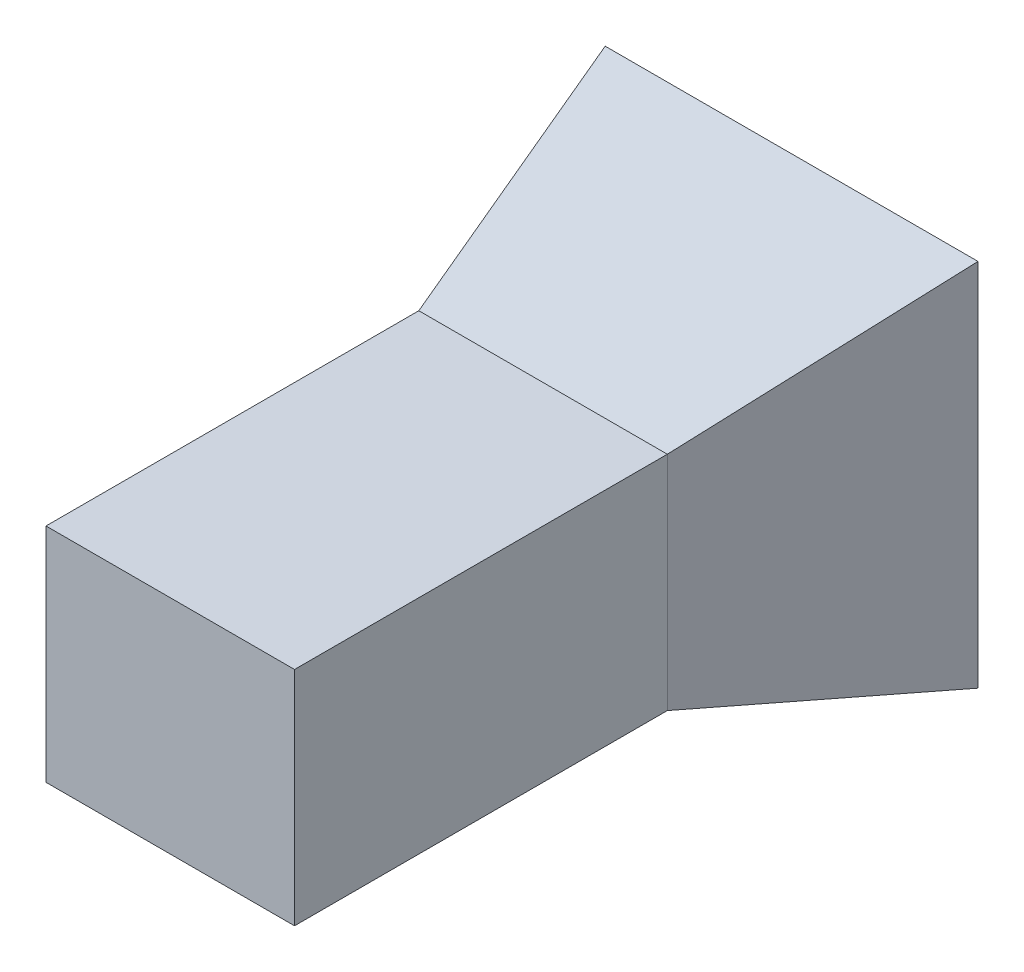
ISO-10303-21;
HEADER;
FILE_DESCRIPTION(('STEP AP214'),'2;1');
FILE_NAME('part.step','',(''),(''),'','','');
FILE_SCHEMA(('AUTOMOTIVE_DESIGN { 1 0 10303 214 1 1 1 1 }'));
ENDSEC;
DATA;
#1=APPLICATION_CONTEXT('core data for automotive mechanical design processes');
#2=APPLICATION_PROTOCOL_DEFINITION('international standard','automotive_design',2000,#1);
#3=PRODUCT_CONTEXT('',#1,'mechanical');
#4=PRODUCT('Part','Part','',(#3));
#5=PRODUCT_RELATED_PRODUCT_CATEGORY('part','',(#4));
#6=PRODUCT_DEFINITION_FORMATION('','',#4);
#7=PRODUCT_DEFINITION_CONTEXT('part definition',#1,'design');
#8=PRODUCT_DEFINITION('design','',#6,#7);
#9=PRODUCT_DEFINITION_SHAPE('','',#8);
#10=(LENGTH_UNIT() NAMED_UNIT(*) SI_UNIT(.MILLI.,.METRE.));
#11=(NAMED_UNIT(*) PLANE_ANGLE_UNIT() SI_UNIT($,.RADIAN.));
#12=(NAMED_UNIT(*) SI_UNIT($,.STERADIAN.) SOLID_ANGLE_UNIT());
#13=UNCERTAINTY_MEASURE_WITH_UNIT(LENGTH_MEASURE(1.E-05),#10,'distance_accuracy_value','');
#14=(GEOMETRIC_REPRESENTATION_CONTEXT(3) GLOBAL_UNCERTAINTY_ASSIGNED_CONTEXT((#13)) GLOBAL_UNIT_ASSIGNED_CONTEXT((#10,
#11,#12)) REPRESENTATION_CONTEXT('',''));
#15=CARTESIAN_POINT('',(0.,0.,0.));
#16=DIRECTION('',(0.,0.,1.));
#17=DIRECTION('',(1.,0.,0.));
#18=AXIS2_PLACEMENT_3D('',#15,#16,#17);
#19=CARTESIAN_POINT('',(0.,0.,0.));
#20=DIRECTION('',(0.,0.,1.));
#21=DIRECTION('',(1.,0.,0.));
#22=AXIS2_PLACEMENT_3D('',#19,#20,#21);
#23=PLANE('',#22);
#24=DIRECTION('',(0.,1.,0.));
#25=VECTOR('',#24,1.);
#26=CARTESIAN_POINT('',(15.,14.8706896551724,0.));
#27=LINE('',#26,#25);
#28=CARTESIAN_POINT('',(15.,-14.8706896551724,0.));
#29=VERTEX_POINT('',#28);
#30=CARTESIAN_POINT('',(15.,14.8706896551724,0.));
#31=VERTEX_POINT('',#30);
#32=EDGE_CURVE('E128',#29,#31,#27,.T.);
#33=ORIENTED_EDGE('',*,*,#32,.F.);
#34=DIRECTION('',(1.,0.,0.));
#35=VECTOR('',#34,1.);
#36=CARTESIAN_POINT('',(-15.,-14.8706896551724,0.));
#37=LINE('',#36,#35);
#38=CARTESIAN_POINT('',(-15.,-14.8706896551724,0.));
#39=VERTEX_POINT('',#38);
#40=EDGE_CURVE('E130',#39,#29,#37,.T.);
#41=ORIENTED_EDGE('',*,*,#40,.F.);
#42=DIRECTION('',(0.,-1.,0.));
#43=VECTOR('',#42,1.);
#44=CARTESIAN_POINT('',(-15.,14.8706896551724,0.));
#45=LINE('',#44,#43);
#46=CARTESIAN_POINT('',(-15.,14.8706896551724,0.));
#47=VERTEX_POINT('',#46);
#48=EDGE_CURVE('E189',#47,#39,#45,.T.);
#49=ORIENTED_EDGE('',*,*,#48,.F.);
#50=DIRECTION('',(-1.,0.,0.));
#51=VECTOR('',#50,1.);
#52=CARTESIAN_POINT('',(-15.,14.8706896551724,0.));
#53=LINE('',#52,#51);
#54=EDGE_CURVE('E193',#31,#47,#53,.T.);
#55=ORIENTED_EDGE('',*,*,#54,.F.);
#56=EDGE_LOOP('',(#33,#41,#49,#55));
#57=FACE_BOUND('',#56,.T.);
#58=ADVANCED_FACE('F43',(#57),#23,.F.);
#59=CARTESIAN_POINT('',(0.,13.6661971153514,4.05719514851869));
#60=DIRECTION('',(0.,-0.95864604562917,-0.284601052702823));
#61=DIRECTION('',(0.,0.284601052702823,-0.95864604562917));
#62=AXIS2_PLACEMENT_3D('',#59,#60,#61);
#63=PLANE('',#62);
#64=DIRECTION('',(0.233061700659954,-0.276763694608473,0.932246802639815));
#65=VECTOR('',#64,1.);
#66=CARTESIAN_POINT('',(-15.,14.8706896551724,0.));
#67=LINE('',#66,#65);
#68=CARTESIAN_POINT('',(-10.,8.93312690194505,20.));
#69=VERTEX_POINT('',#68);
#70=EDGE_CURVE('E202',#47,#69,#67,.T.);
#71=ORIENTED_EDGE('',*,*,#70,.T.);
#72=DIRECTION('',(-1.,0.,0.));
#73=VECTOR('',#72,1.);
#74=CARTESIAN_POINT('',(-10.,8.93312690194505,20.));
#75=LINE('',#74,#73);
#76=CARTESIAN_POINT('',(10.,8.93312690194505,20.));
#77=VERTEX_POINT('',#76);
#78=EDGE_CURVE('E12',#77,#69,#75,.T.);
#79=ORIENTED_EDGE('',*,*,#78,.F.);
#80=DIRECTION('',(-0.233061700659954,-0.276763694608473,0.932246802639815));
#81=VECTOR('',#80,1.);
#82=CARTESIAN_POINT('',(15.,14.8706896551724,0.));
#83=LINE('',#82,#81);
#84=EDGE_CURVE('E62',#31,#77,#83,.T.);
#85=ORIENTED_EDGE('',*,*,#84,.F.);
#86=ORIENTED_EDGE('',*,*,#54,.T.);
#87=EDGE_LOOP('',(#71,#79,#85,#86));
#88=FACE_BOUND('',#87,.T.);
#89=ADVANCED_FACE('F159',(#88),#63,.F.);
#90=CARTESIAN_POINT('',(14.1176470588235,0.,3.52941176470588));
#91=DIRECTION('',(-0.970142500145332,0.,-0.242535625036333));
#92=DIRECTION('',(-0.242535625036333,0.,0.970142500145332));
#93=AXIS2_PLACEMENT_3D('',#90,#91,#92);
#94=PLANE('',#93);
#95=ORIENTED_EDGE('',*,*,#84,.T.);
#96=DIRECTION('',(0.,1.,0.));
#97=VECTOR('',#96,1.);
#98=CARTESIAN_POINT('',(10.,8.93312690194505,20.));
#99=LINE('',#98,#97);
#100=CARTESIAN_POINT('',(10.,-8.93312690194505,20.));
#101=VERTEX_POINT('',#100);
#102=EDGE_CURVE('E48',#101,#77,#99,.T.);
#103=ORIENTED_EDGE('',*,*,#102,.F.);
#104=DIRECTION('',(-0.233061700659954,0.276763694608473,0.932246802639815));
#105=VECTOR('',#104,1.);
#106=CARTESIAN_POINT('',(15.,-14.8706896551724,0.));
#107=LINE('',#106,#105);
#108=EDGE_CURVE('E207',#29,#101,#107,.T.);
#109=ORIENTED_EDGE('',*,*,#108,.F.);
#110=ORIENTED_EDGE('',*,*,#32,.T.);
#111=EDGE_LOOP('',(#95,#103,#109,#110));
#112=FACE_BOUND('',#111,.T.);
#113=ADVANCED_FACE('F206',(#112),#94,.F.);
#114=CARTESIAN_POINT('',(-14.1176470588235,0.,3.52941176470588));
#115=DIRECTION('',(0.970142500145332,0.,-0.242535625036333));
#116=DIRECTION('',(-0.242535625036333,0.,-0.970142500145332));
#117=AXIS2_PLACEMENT_3D('',#114,#115,#116);
#118=PLANE('',#117);
#119=DIRECTION('',(0.233061700659954,0.276763694608473,0.932246802639815));
#120=VECTOR('',#119,1.);
#121=CARTESIAN_POINT('',(-15.,-14.8706896551724,0.));
#122=LINE('',#121,#120);
#123=CARTESIAN_POINT('',(-10.,-8.93312690194505,20.));
#124=VERTEX_POINT('',#123);
#125=EDGE_CURVE('E211',#39,#124,#122,.T.);
#126=ORIENTED_EDGE('',*,*,#125,.T.);
#127=DIRECTION('',(0.,-1.,0.));
#128=VECTOR('',#127,1.);
#129=CARTESIAN_POINT('',(-10.,8.93312690194505,20.));
#130=LINE('',#129,#128);
#131=EDGE_CURVE('E54',#69,#124,#130,.T.);
#132=ORIENTED_EDGE('',*,*,#131,.F.);
#133=ORIENTED_EDGE('',*,*,#70,.F.);
#134=ORIENTED_EDGE('',*,*,#48,.T.);
#135=EDGE_LOOP('',(#126,#132,#133,#134));
#136=FACE_BOUND('',#135,.T.);
#137=ADVANCED_FACE('F228',(#136),#118,.F.);
#138=CARTESIAN_POINT('',(0.,-13.6661971153514,4.05719514851869));
#139=DIRECTION('',(0.,0.95864604562917,-0.284601052702823));
#140=DIRECTION('',(0.,0.284601052702823,0.95864604562917));
#141=AXIS2_PLACEMENT_3D('',#138,#139,#140);
#142=PLANE('',#141);
#143=ORIENTED_EDGE('',*,*,#108,.T.);
#144=DIRECTION('',(1.,0.,0.));
#145=VECTOR('',#144,1.);
#146=CARTESIAN_POINT('',(-10.,-8.93312690194505,20.));
#147=LINE('',#146,#145);
#148=EDGE_CURVE('E126',#124,#101,#147,.T.);
#149=ORIENTED_EDGE('',*,*,#148,.F.);
#150=ORIENTED_EDGE('',*,*,#125,.F.);
#151=ORIENTED_EDGE('',*,*,#40,.T.);
#152=EDGE_LOOP('',(#143,#149,#150,#151));
#153=FACE_BOUND('',#152,.T.);
#154=ADVANCED_FACE('F45',(#153),#142,.F.);
#155=CARTESIAN_POINT('',(-10.,-8.93312690194505,50.));
#156=DIRECTION('',(0.,1.,0.));
#157=DIRECTION('',(0.,0.,1.));
#158=AXIS2_PLACEMENT_3D('',#155,#156,#157);
#159=PLANE('',#158);
#160=ORIENTED_EDGE('',*,*,#148,.T.);
#161=DIRECTION('',(0.,0.,-1.));
#162=VECTOR('',#161,1.);
#163=CARTESIAN_POINT('',(10.,-8.93312690194505,50.));
#164=LINE('',#163,#162);
#165=CARTESIAN_POINT('',(10.,-8.93312690194505,50.));
#166=VERTEX_POINT('',#165);
#167=EDGE_CURVE('E108',#166,#101,#164,.T.);
#168=ORIENTED_EDGE('',*,*,#167,.F.);
#169=DIRECTION('',(1.,0.,0.));
#170=VECTOR('',#169,1.);
#171=CARTESIAN_POINT('',(-10.,-8.93312690194505,50.));
#172=LINE('',#171,#170);
#173=CARTESIAN_POINT('',(-10.,-8.93312690194505,50.));
#174=VERTEX_POINT('',#173);
#175=EDGE_CURVE('E115',#174,#166,#172,.T.);
#176=ORIENTED_EDGE('',*,*,#175,.F.);
#177=DIRECTION('',(0.,0.,-1.));
#178=VECTOR('',#177,1.);
#179=CARTESIAN_POINT('',(-10.,-8.93312690194505,50.));
#180=LINE('',#179,#178);
#181=EDGE_CURVE('E282',#174,#124,#180,.T.);
#182=ORIENTED_EDGE('',*,*,#181,.T.);
#183=EDGE_LOOP('',(#160,#168,#176,#182));
#184=FACE_BOUND('',#183,.T.);
#185=ADVANCED_FACE('F125',(#184),#159,.F.);
#186=CARTESIAN_POINT('',(10.,-8.93312690194505,50.));
#187=DIRECTION('',(-1.,0.,0.));
#188=DIRECTION('',(0.,0.,1.));
#189=AXIS2_PLACEMENT_3D('',#186,#187,#188);
#190=PLANE('',#189);
#191=ORIENTED_EDGE('',*,*,#102,.T.);
#192=DIRECTION('',(0.,0.,-1.));
#193=VECTOR('',#192,1.);
#194=CARTESIAN_POINT('',(10.,8.93312690194505,50.));
#195=LINE('',#194,#193);
#196=CARTESIAN_POINT('',(10.,8.93312690194505,50.));
#197=VERTEX_POINT('',#196);
#198=EDGE_CURVE('E111',#197,#77,#195,.T.);
#199=ORIENTED_EDGE('',*,*,#198,.F.);
#200=DIRECTION('',(0.,1.,0.));
#201=VECTOR('',#200,1.);
#202=CARTESIAN_POINT('',(10.,-8.93312690194505,50.));
#203=LINE('',#202,#201);
#204=EDGE_CURVE('E103',#166,#197,#203,.T.);
#205=ORIENTED_EDGE('',*,*,#204,.F.);
#206=ORIENTED_EDGE('',*,*,#167,.T.);
#207=EDGE_LOOP('',(#191,#199,#205,#206));
#208=FACE_BOUND('',#207,.T.);
#209=ADVANCED_FACE('F106',(#208),#190,.F.);
#210=CARTESIAN_POINT('',(10.,8.93312690194505,50.));
#211=DIRECTION('',(0.,-1.,0.));
#212=DIRECTION('',(0.,0.,-1.));
#213=AXIS2_PLACEMENT_3D('',#210,#211,#212);
#214=PLANE('',#213);
#215=ORIENTED_EDGE('',*,*,#78,.T.);
#216=DIRECTION('',(0.,0.,-1.));
#217=VECTOR('',#216,1.);
#218=CARTESIAN_POINT('',(-10.,8.93312690194505,50.));
#219=LINE('',#218,#217);
#220=CARTESIAN_POINT('',(-10.,8.93312690194505,50.));
#221=VERTEX_POINT('',#220);
#222=EDGE_CURVE('E132',#221,#69,#219,.T.);
#223=ORIENTED_EDGE('',*,*,#222,.F.);
#224=DIRECTION('',(-1.,0.,0.));
#225=VECTOR('',#224,1.);
#226=CARTESIAN_POINT('',(10.,8.93312690194505,50.));
#227=LINE('',#226,#225);
#228=EDGE_CURVE('E114',#197,#221,#227,.T.);
#229=ORIENTED_EDGE('',*,*,#228,.F.);
#230=ORIENTED_EDGE('',*,*,#198,.T.);
#231=EDGE_LOOP('',(#215,#223,#229,#230));
#232=FACE_BOUND('',#231,.T.);
#233=ADVANCED_FACE('F292',(#232),#214,.F.);
#234=CARTESIAN_POINT('',(-10.,8.93312690194505,50.));
#235=DIRECTION('',(1.,0.,0.));
#236=DIRECTION('',(0.,0.,-1.));
#237=AXIS2_PLACEMENT_3D('',#234,#235,#236);
#238=PLANE('',#237);
#239=ORIENTED_EDGE('',*,*,#131,.T.);
#240=ORIENTED_EDGE('',*,*,#181,.F.);
#241=DIRECTION('',(0.,-1.,0.));
#242=VECTOR('',#241,1.);
#243=CARTESIAN_POINT('',(-10.,8.93312690194505,50.));
#244=LINE('',#243,#242);
#245=EDGE_CURVE('E120',#221,#174,#244,.T.);
#246=ORIENTED_EDGE('',*,*,#245,.F.);
#247=ORIENTED_EDGE('',*,*,#222,.T.);
#248=EDGE_LOOP('',(#239,#240,#246,#247));
#249=FACE_BOUND('',#248,.T.);
#250=ADVANCED_FACE('F281',(#249),#238,.F.);
#251=CARTESIAN_POINT('',(0.,0.,50.));
#252=DIRECTION('',(0.,0.,1.));
#253=DIRECTION('',(1.,0.,0.));
#254=AXIS2_PLACEMENT_3D('',#251,#252,#253);
#255=PLANE('',#254);
#256=ORIENTED_EDGE('',*,*,#175,.T.);
#257=ORIENTED_EDGE('',*,*,#204,.T.);
#258=ORIENTED_EDGE('',*,*,#228,.T.);
#259=ORIENTED_EDGE('',*,*,#245,.T.);
#260=EDGE_LOOP('',(#256,#257,#258,#259));
#261=FACE_BOUND('',#260,.T.);
#262=ADVANCED_FACE('F118',(#261),#255,.T.);
#263=CLOSED_SHELL('',(#58,#89,#113,#137,#154,#185,#209,#233,#250,#262));
#264=MANIFOLD_SOLID_BREP('B2',#263);
#265=ADVANCED_BREP_SHAPE_REPRESENTATION('',(#18,#264),#14);
#266=SHAPE_DEFINITION_REPRESENTATION(#9,#265);
ENDSEC;
END-ISO-10303-21;
